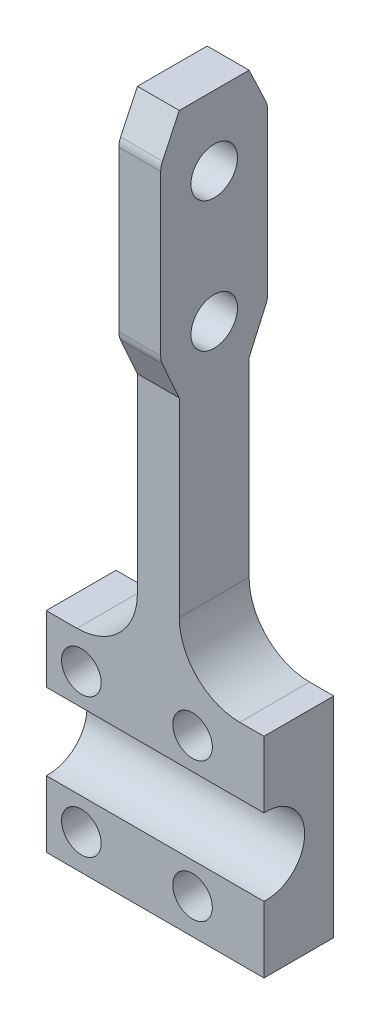
ISO-10303-21;
HEADER;
FILE_DESCRIPTION(('STEP AP214'),'2;1');
FILE_NAME('part.step','',(''),(''),'','','');
FILE_SCHEMA(('AUTOMOTIVE_DESIGN { 1 0 10303 214 1 1 1 1 }'));
ENDSEC;
DATA;
#1=APPLICATION_CONTEXT('core data for automotive mechanical design processes');
#2=APPLICATION_PROTOCOL_DEFINITION('international standard','automotive_design',2000,#1);
#3=PRODUCT_CONTEXT('',#1,'mechanical');
#4=PRODUCT('Part','Part','',(#3));
#5=PRODUCT_RELATED_PRODUCT_CATEGORY('part','',(#4));
#6=PRODUCT_DEFINITION_FORMATION('','',#4);
#7=PRODUCT_DEFINITION_CONTEXT('part definition',#1,'design');
#8=PRODUCT_DEFINITION('design','',#6,#7);
#9=PRODUCT_DEFINITION_SHAPE('','',#8);
#10=(LENGTH_UNIT() NAMED_UNIT(*) SI_UNIT(.MILLI.,.METRE.));
#11=(NAMED_UNIT(*) PLANE_ANGLE_UNIT() SI_UNIT($,.RADIAN.));
#12=(NAMED_UNIT(*) SI_UNIT($,.STERADIAN.) SOLID_ANGLE_UNIT());
#13=UNCERTAINTY_MEASURE_WITH_UNIT(LENGTH_MEASURE(1.E-05),#10,'distance_accuracy_value','');
#14=(GEOMETRIC_REPRESENTATION_CONTEXT(3) GLOBAL_UNCERTAINTY_ASSIGNED_CONTEXT((#13)) GLOBAL_UNIT_ASSIGNED_CONTEXT((#10,
#11,#12)) REPRESENTATION_CONTEXT('',''));
#15=CARTESIAN_POINT('',(0.,0.,0.));
#16=DIRECTION('',(0.,0.,1.));
#17=DIRECTION('',(1.,0.,0.));
#18=AXIS2_PLACEMENT_3D('',#15,#16,#17);
#19=CARTESIAN_POINT('',(27.1,35.5,0.));
#20=DIRECTION('',(0.,0.,1.));
#21=DIRECTION('',(-1.,0.,0.));
#22=AXIS2_PLACEMENT_3D('',#19,#20,#21);
#23=PLANE('',#22);
#24=CARTESIAN_POINT('',(51.95,14.95,0.));
#25=DIRECTION('',(0.,0.,-1.));
#26=DIRECTION('',(-1.,0.,0.));
#27=AXIS2_PLACEMENT_3D('',#24,#25,#26);
#28=CIRCLE('',#27,4.25);
#29=CARTESIAN_POINT('',(47.7,14.95,0.));
#30=VERTEX_POINT('',#29);
#31=EDGE_CURVE('E279',#30,#30,#28,.T.);
#32=ORIENTED_EDGE('',*,*,#31,.F.);
#33=EDGE_LOOP('',(#32));
#34=FACE_BOUND('',#33,.T.);
#35=CARTESIAN_POINT('',(28.05,14.95,0.));
#36=DIRECTION('',(0.,0.,-1.));
#37=DIRECTION('',(-1.,0.,0.));
#38=AXIS2_PLACEMENT_3D('',#35,#36,#37);
#39=CIRCLE('',#38,4.25);
#40=CARTESIAN_POINT('',(23.8,14.95,0.));
#41=VERTEX_POINT('',#40);
#42=EDGE_CURVE('E283',#41,#41,#39,.T.);
#43=ORIENTED_EDGE('',*,*,#42,.F.);
#44=EDGE_LOOP('',(#43));
#45=FACE_BOUND('',#44,.T.);
#46=CARTESIAN_POINT('',(28.05,-14.95,0.));
#47=DIRECTION('',(0.,0.,-1.));
#48=DIRECTION('',(-1.,0.,0.));
#49=AXIS2_PLACEMENT_3D('',#46,#47,#48);
#50=CIRCLE('',#49,4.25);
#51=CARTESIAN_POINT('',(23.8,-14.95,0.));
#52=VERTEX_POINT('',#51);
#53=EDGE_CURVE('E289',#52,#52,#50,.T.);
#54=ORIENTED_EDGE('',*,*,#53,.F.);
#55=EDGE_LOOP('',(#54));
#56=FACE_BOUND('',#55,.T.);
#57=CARTESIAN_POINT('',(51.95,-14.95,0.));
#58=DIRECTION('',(0.,0.,-1.));
#59=DIRECTION('',(-1.,0.,0.));
#60=AXIS2_PLACEMENT_3D('',#57,#58,#59);
#61=CIRCLE('',#60,4.25);
#62=CARTESIAN_POINT('',(47.7,-14.95,0.));
#63=VERTEX_POINT('',#62);
#64=EDGE_CURVE('E295',#63,#63,#61,.T.);
#65=ORIENTED_EDGE('',*,*,#64,.F.);
#66=EDGE_LOOP('',(#65));
#67=FACE_BOUND('',#66,.T.);
#68=DIRECTION('',(1.,0.,0.));
#69=VECTOR('',#68,1.);
#70=CARTESIAN_POINT('',(-13.5624362774462,76.3868514547035,0.));
#71=LINE('',#70,#69);
#72=CARTESIAN_POINT('',(40.1,76.3868514547035,0.));
#73=VERTEX_POINT('',#72);
#74=CARTESIAN_POINT('',(49.1,76.3868514547035,0.));
#75=VERTEX_POINT('',#74);
#76=EDGE_CURVE('E189',#73,#75,#71,.T.);
#77=ORIENTED_EDGE('',*,*,#76,.T.);
#78=DIRECTION('',(0.,-1.,0.));
#79=VECTOR('',#78,1.);
#80=CARTESIAN_POINT('',(49.1,22.5,0.));
#81=LINE('',#80,#79);
#82=CARTESIAN_POINT('',(49.1,35.5,0.));
#83=VERTEX_POINT('',#82);
#84=EDGE_CURVE('E201',#75,#83,#81,.T.);
#85=ORIENTED_EDGE('',*,*,#84,.T.);
#86=CARTESIAN_POINT('',(62.1,35.5,0.));
#87=DIRECTION('',(0.,0.,-1.));
#88=DIRECTION('',(-1.,0.,0.));
#89=AXIS2_PLACEMENT_3D('',#86,#87,#88);
#90=CIRCLE('',#89,13.);
#91=CARTESIAN_POINT('',(62.1,22.5,0.));
#92=VERTEX_POINT('',#91);
#93=EDGE_CURVE('E41',#92,#83,#90,.T.);
#94=ORIENTED_EDGE('',*,*,#93,.F.);
#95=DIRECTION('',(1.,0.,0.));
#96=VECTOR('',#95,1.);
#97=CARTESIAN_POINT('',(49.1,22.5,0.));
#98=LINE('',#97,#96);
#99=CARTESIAN_POINT('',(67.3,22.5,0.));
#100=VERTEX_POINT('',#99);
#101=EDGE_CURVE('E352',#92,#100,#98,.T.);
#102=ORIENTED_EDGE('',*,*,#101,.T.);
#103=DIRECTION('',(0.,-1.,0.));
#104=VECTOR('',#103,1.);
#105=CARTESIAN_POINT('',(67.3,22.5,0.));
#106=LINE('',#105,#104);
#107=CARTESIAN_POINT('',(67.3,-22.5,0.));
#108=VERTEX_POINT('',#107);
#109=EDGE_CURVE('E308',#100,#108,#106,.T.);
#110=ORIENTED_EDGE('',*,*,#109,.T.);
#111=DIRECTION('',(-1.,0.,0.));
#112=VECTOR('',#111,1.);
#113=CARTESIAN_POINT('',(67.3,-22.5,0.));
#114=LINE('',#113,#112);
#115=CARTESIAN_POINT('',(20.5,-22.5,0.));
#116=VERTEX_POINT('',#115);
#117=EDGE_CURVE('E301',#108,#116,#114,.T.);
#118=ORIENTED_EDGE('',*,*,#117,.T.);
#119=DIRECTION('',(0.,1.,0.));
#120=VECTOR('',#119,1.);
#121=CARTESIAN_POINT('',(20.5,-22.5,0.));
#122=LINE('',#121,#120);
#123=CARTESIAN_POINT('',(20.5,22.5,0.));
#124=VERTEX_POINT('',#123);
#125=EDGE_CURVE('E336',#116,#124,#122,.T.);
#126=ORIENTED_EDGE('',*,*,#125,.T.);
#127=DIRECTION('',(1.,0.,0.));
#128=VECTOR('',#127,1.);
#129=CARTESIAN_POINT('',(20.5,22.5,0.));
#130=LINE('',#129,#128);
#131=CARTESIAN_POINT('',(27.0999999999999,22.5,0.));
#132=VERTEX_POINT('',#131);
#133=EDGE_CURVE('E339',#124,#132,#130,.T.);
#134=ORIENTED_EDGE('',*,*,#133,.T.);
#135=CARTESIAN_POINT('',(27.1,35.5,0.));
#136=DIRECTION('',(0.,0.,1.));
#137=DIRECTION('',(-1.,0.,0.));
#138=AXIS2_PLACEMENT_3D('',#135,#136,#137);
#139=CIRCLE('',#138,13.);
#140=CARTESIAN_POINT('',(40.1,35.5000000000001,0.));
#141=VERTEX_POINT('',#140);
#142=EDGE_CURVE('E342',#132,#141,#139,.T.);
#143=ORIENTED_EDGE('',*,*,#142,.T.);
#144=DIRECTION('',(0.,1.,0.));
#145=VECTOR('',#144,1.);
#146=CARTESIAN_POINT('',(40.1,35.5000000000001,0.));
#147=LINE('',#146,#145);
#148=EDGE_CURVE('E345',#141,#73,#147,.T.);
#149=ORIENTED_EDGE('',*,*,#148,.T.);
#150=EDGE_LOOP('',(#77,#85,#94,#102,#110,#118,#126,#134,#143,#149));
#151=FACE_BOUND('',#150,.T.);
#152=ADVANCED_FACE('F33',(#34,#45,#56,#67,#151),#23,.F.);
#153=CARTESIAN_POINT('',(27.1,35.5,15.));
#154=DIRECTION('',(0.,0.,1.));
#155=DIRECTION('',(-1.,0.,0.));
#156=AXIS2_PLACEMENT_3D('',#153,#154,#155);
#157=PLANE('',#156);
#158=DIRECTION('',(1.,0.,0.));
#159=VECTOR('',#158,1.);
#160=CARTESIAN_POINT('',(-13.5624362774462,76.3868514547035,15.));
#161=LINE('',#160,#159);
#162=CARTESIAN_POINT('',(40.1,76.3868514547035,15.));
#163=VERTEX_POINT('',#162);
#164=CARTESIAN_POINT('',(49.1,76.3868514547035,15.));
#165=VERTEX_POINT('',#164);
#166=EDGE_CURVE('E250',#163,#165,#161,.T.);
#167=ORIENTED_EDGE('',*,*,#166,.F.);
#168=DIRECTION('',(0.,1.,0.));
#169=VECTOR('',#168,1.);
#170=CARTESIAN_POINT('',(40.1,35.5000000000001,15.));
#171=LINE('',#170,#169);
#172=CARTESIAN_POINT('',(40.1,35.5000000000001,15.));
#173=VERTEX_POINT('',#172);
#174=EDGE_CURVE('E318',#173,#163,#171,.T.);
#175=ORIENTED_EDGE('',*,*,#174,.F.);
#176=CARTESIAN_POINT('',(27.1,35.5,15.));
#177=DIRECTION('',(0.,0.,1.));
#178=DIRECTION('',(-1.,0.,0.));
#179=AXIS2_PLACEMENT_3D('',#176,#177,#178);
#180=CIRCLE('',#179,13.);
#181=CARTESIAN_POINT('',(27.0999999999999,22.5,15.));
#182=VERTEX_POINT('',#181);
#183=EDGE_CURVE('E315',#182,#173,#180,.T.);
#184=ORIENTED_EDGE('',*,*,#183,.F.);
#185=DIRECTION('',(1.,0.,0.));
#186=VECTOR('',#185,1.);
#187=CARTESIAN_POINT('',(20.5,22.5,15.));
#188=LINE('',#187,#186);
#189=CARTESIAN_POINT('',(20.5,22.5,15.));
#190=VERTEX_POINT('',#189);
#191=EDGE_CURVE('E312',#190,#182,#188,.T.);
#192=ORIENTED_EDGE('',*,*,#191,.F.);
#193=DIRECTION('',(0.,1.,0.));
#194=VECTOR('',#193,1.);
#195=CARTESIAN_POINT('',(20.5,-22.5,15.));
#196=LINE('',#195,#194);
#197=CARTESIAN_POINT('',(20.5,8.2348345460003,15.));
#198=VERTEX_POINT('',#197);
#199=EDGE_CURVE('E307',#198,#190,#196,.T.);
#200=ORIENTED_EDGE('',*,*,#199,.F.);
#201=DIRECTION('',(1.,0.,0.));
#202=VECTOR('',#201,1.);
#203=CARTESIAN_POINT('',(12.25,8.2348345460003,15.));
#204=LINE('',#203,#202);
#205=CARTESIAN_POINT('',(67.3,8.23483454600031,15.));
#206=VERTEX_POINT('',#205);
#207=EDGE_CURVE('E276',#198,#206,#204,.T.);
#208=ORIENTED_EDGE('',*,*,#207,.T.);
#209=DIRECTION('',(0.,-1.,0.));
#210=VECTOR('',#209,1.);
#211=CARTESIAN_POINT('',(67.3,22.5,15.));
#212=LINE('',#211,#210);
#213=CARTESIAN_POINT('',(67.3,22.5,15.));
#214=VERTEX_POINT('',#213);
#215=EDGE_CURVE('E330',#214,#206,#212,.T.);
#216=ORIENTED_EDGE('',*,*,#215,.F.);
#217=DIRECTION('',(1.,0.,0.));
#218=VECTOR('',#217,1.);
#219=CARTESIAN_POINT('',(49.1,22.5,15.));
#220=LINE('',#219,#218);
#221=CARTESIAN_POINT('',(62.1,22.5,15.));
#222=VERTEX_POINT('',#221);
#223=EDGE_CURVE('E326',#222,#214,#220,.T.);
#224=ORIENTED_EDGE('',*,*,#223,.F.);
#225=CARTESIAN_POINT('',(62.1,35.5,15.));
#226=DIRECTION('',(0.,0.,-1.));
#227=DIRECTION('',(-1.,0.,0.));
#228=AXIS2_PLACEMENT_3D('',#225,#226,#227);
#229=CIRCLE('',#228,13.);
#230=CARTESIAN_POINT('',(49.1,35.5,15.));
#231=VERTEX_POINT('',#230);
#232=EDGE_CURVE('E11',#231,#222,#229,.F.);
#233=ORIENTED_EDGE('',*,*,#232,.F.);
#234=DIRECTION('',(0.,-1.,0.));
#235=VECTOR('',#234,1.);
#236=CARTESIAN_POINT('',(49.1,22.5,15.));
#237=LINE('',#236,#235);
#238=EDGE_CURVE('E324',#165,#231,#237,.T.);
#239=ORIENTED_EDGE('',*,*,#238,.F.);
#240=EDGE_LOOP('',(#167,#175,#184,#192,#200,#208,#216,#224,#233,#239));
#241=FACE_BOUND('',#240,.T.);
#242=CARTESIAN_POINT('',(51.95,14.95,15.));
#243=DIRECTION('',(0.,0.,-1.));
#244=DIRECTION('',(-1.,0.,0.));
#245=AXIS2_PLACEMENT_3D('',#242,#243,#244);
#246=CIRCLE('',#245,4.25);
#247=CARTESIAN_POINT('',(47.7,14.95,15.));
#248=VERTEX_POINT('',#247);
#249=EDGE_CURVE('E280',#248,#248,#246,.T.);
#250=ORIENTED_EDGE('',*,*,#249,.T.);
#251=EDGE_LOOP('',(#250));
#252=FACE_BOUND('',#251,.T.);
#253=CARTESIAN_POINT('',(28.05,14.95,15.));
#254=DIRECTION('',(0.,0.,-1.));
#255=DIRECTION('',(-1.,0.,0.));
#256=AXIS2_PLACEMENT_3D('',#253,#254,#255);
#257=CIRCLE('',#256,4.25);
#258=CARTESIAN_POINT('',(23.8,14.95,15.));
#259=VERTEX_POINT('',#258);
#260=EDGE_CURVE('E286',#259,#259,#257,.T.);
#261=ORIENTED_EDGE('',*,*,#260,.T.);
#262=EDGE_LOOP('',(#261));
#263=FACE_BOUND('',#262,.T.);
#264=ADVANCED_FACE('F423',(#241,#252,#263),#157,.T.);
#265=DIRECTION('',(1.,0.,0.));
#266=VECTOR('',#265,1.);
#267=CARTESIAN_POINT('',(12.25,-8.2348345460003,15.));
#268=LINE('',#267,#266);
#269=CARTESIAN_POINT('',(67.3,-8.23483454600029,15.));
#270=VERTEX_POINT('',#269);
#271=CARTESIAN_POINT('',(20.5,-8.2348345460003,15.));
#272=VERTEX_POINT('',#271);
#273=EDGE_CURVE('E273',#270,#272,#268,.F.);
#274=ORIENTED_EDGE('',*,*,#273,.T.);
#275=CARTESIAN_POINT('',(20.5,-22.5,15.));
#276=VERTEX_POINT('',#275);
#277=EDGE_CURVE('E309',#276,#272,#196,.T.);
#278=ORIENTED_EDGE('',*,*,#277,.F.);
#279=DIRECTION('',(-1.,0.,0.));
#280=VECTOR('',#279,1.);
#281=CARTESIAN_POINT('',(67.3,-22.5,15.));
#282=LINE('',#281,#280);
#283=CARTESIAN_POINT('',(67.3,-22.5,15.));
#284=VERTEX_POINT('',#283);
#285=EDGE_CURVE('E304',#284,#276,#282,.T.);
#286=ORIENTED_EDGE('',*,*,#285,.F.);
#287=EDGE_CURVE('E329',#270,#284,#212,.T.);
#288=ORIENTED_EDGE('',*,*,#287,.F.);
#289=EDGE_LOOP('',(#274,#278,#286,#288));
#290=FACE_BOUND('',#289,.T.);
#291=CARTESIAN_POINT('',(51.95,-14.95,15.));
#292=DIRECTION('',(0.,0.,-1.));
#293=DIRECTION('',(-1.,0.,0.));
#294=AXIS2_PLACEMENT_3D('',#291,#292,#293);
#295=CIRCLE('',#294,4.25);
#296=CARTESIAN_POINT('',(47.7,-14.95,15.));
#297=VERTEX_POINT('',#296);
#298=EDGE_CURVE('E298',#297,#297,#295,.T.);
#299=ORIENTED_EDGE('',*,*,#298,.T.);
#300=EDGE_LOOP('',(#299));
#301=FACE_BOUND('',#300,.T.);
#302=CARTESIAN_POINT('',(28.05,-14.95,15.));
#303=DIRECTION('',(0.,0.,-1.));
#304=DIRECTION('',(-1.,0.,0.));
#305=AXIS2_PLACEMENT_3D('',#302,#303,#304);
#306=CIRCLE('',#305,4.25);
#307=CARTESIAN_POINT('',(23.8,-14.95,15.));
#308=VERTEX_POINT('',#307);
#309=EDGE_CURVE('E292',#308,#308,#306,.T.);
#310=ORIENTED_EDGE('',*,*,#309,.T.);
#311=EDGE_LOOP('',(#310));
#312=FACE_BOUND('',#311,.T.);
#313=ADVANCED_FACE('F429',(#290,#301,#312),#157,.T.);
#314=CARTESIAN_POINT('',(67.3,-22.5,15.));
#315=DIRECTION('',(0.,1.,0.));
#316=DIRECTION('',(0.,0.,1.));
#317=AXIS2_PLACEMENT_3D('',#314,#315,#316);
#318=PLANE('',#317);
#319=ORIENTED_EDGE('',*,*,#117,.F.);
#320=DIRECTION('',(0.,0.,-1.));
#321=VECTOR('',#320,1.);
#322=CARTESIAN_POINT('',(67.3,-22.5,15.));
#323=LINE('',#322,#321);
#324=EDGE_CURVE('E333',#284,#108,#323,.T.);
#325=ORIENTED_EDGE('',*,*,#324,.F.);
#326=ORIENTED_EDGE('',*,*,#285,.T.);
#327=DIRECTION('',(0.,0.,-1.));
#328=VECTOR('',#327,1.);
#329=CARTESIAN_POINT('',(20.5,-22.5,15.));
#330=LINE('',#329,#328);
#331=EDGE_CURVE('E372',#276,#116,#330,.T.);
#332=ORIENTED_EDGE('',*,*,#331,.T.);
#333=EDGE_LOOP('',(#319,#325,#326,#332));
#334=FACE_BOUND('',#333,.T.);
#335=ADVANCED_FACE('F463',(#334),#318,.F.);
#336=CARTESIAN_POINT('',(20.5,-22.5,15.));
#337=DIRECTION('',(1.,0.,0.));
#338=DIRECTION('',(0.,-1.,0.));
#339=AXIS2_PLACEMENT_3D('',#336,#337,#338);
#340=PLANE('',#339);
#341=ORIENTED_EDGE('',*,*,#199,.T.);
#342=DIRECTION('',(0.,0.,-1.));
#343=VECTOR('',#342,1.);
#344=CARTESIAN_POINT('',(20.5,22.5,15.));
#345=LINE('',#344,#343);
#346=EDGE_CURVE('E370',#190,#124,#345,.T.);
#347=ORIENTED_EDGE('',*,*,#346,.T.);
#348=ORIENTED_EDGE('',*,*,#125,.F.);
#349=ORIENTED_EDGE('',*,*,#331,.F.);
#350=ORIENTED_EDGE('',*,*,#277,.T.);
#351=CARTESIAN_POINT('',(20.5,0.,14.5));
#352=DIRECTION('',(-1.,0.,0.));
#353=DIRECTION('',(0.,-1.,0.));
#354=AXIS2_PLACEMENT_3D('',#351,#352,#353);
#355=CIRCLE('',#354,8.25);
#356=EDGE_CURVE('E270',#198,#272,#355,.T.);
#357=ORIENTED_EDGE('',*,*,#356,.F.);
#358=EDGE_LOOP('',(#341,#347,#348,#349,#350,#357));
#359=FACE_BOUND('',#358,.T.);
#360=ADVANCED_FACE('F460',(#359),#340,.F.);
#361=CARTESIAN_POINT('',(20.5,22.5,15.));
#362=DIRECTION('',(0.,-1.,0.));
#363=DIRECTION('',(0.,0.,-1.));
#364=AXIS2_PLACEMENT_3D('',#361,#362,#363);
#365=PLANE('',#364);
#366=ORIENTED_EDGE('',*,*,#133,.F.);
#367=ORIENTED_EDGE('',*,*,#346,.F.);
#368=ORIENTED_EDGE('',*,*,#191,.T.);
#369=DIRECTION('',(0.,0.,-1.));
#370=VECTOR('',#369,1.);
#371=CARTESIAN_POINT('',(27.0999999999999,22.5,15.));
#372=LINE('',#371,#370);
#373=EDGE_CURVE('E368',#182,#132,#372,.T.);
#374=ORIENTED_EDGE('',*,*,#373,.T.);
#375=EDGE_LOOP('',(#366,#367,#368,#374));
#376=FACE_BOUND('',#375,.T.);
#377=ADVANCED_FACE('F456',(#376),#365,.F.);
#378=CARTESIAN_POINT('',(27.1,35.5,15.));
#379=DIRECTION('',(0.,0.,-1.));
#380=DIRECTION('',(1.,0.,0.));
#381=AXIS2_PLACEMENT_3D('',#378,#379,#380);
#382=CYLINDRICAL_SURFACE('',#381,13.);
#383=ORIENTED_EDGE('',*,*,#142,.F.);
#384=ORIENTED_EDGE('',*,*,#373,.F.);
#385=ORIENTED_EDGE('',*,*,#183,.T.);
#386=DIRECTION('',(0.,0.,-1.));
#387=VECTOR('',#386,1.);
#388=CARTESIAN_POINT('',(40.1,35.5000000000001,15.));
#389=LINE('',#388,#387);
#390=EDGE_CURVE('E366',#173,#141,#389,.T.);
#391=ORIENTED_EDGE('',*,*,#390,.T.);
#392=EDGE_LOOP('',(#383,#384,#385,#391));
#393=FACE_BOUND('',#392,.T.);
#394=ADVANCED_FACE('F452',(#393),#382,.F.);
#395=CARTESIAN_POINT('',(40.1,35.5000000000001,15.));
#396=DIRECTION('',(1.,0.,0.));
#397=DIRECTION('',(0.,0.,1.));
#398=AXIS2_PLACEMENT_3D('',#395,#396,#397);
#399=PLANE('',#398);
#400=CARTESIAN_POINT('',(40.1,86.9,7.5));
#401=DIRECTION('',(1.,0.,0.));
#402=DIRECTION('',(0.,0.,-1.));
#403=AXIS2_PLACEMENT_3D('',#400,#401,#402);
#404=CIRCLE('',#403,5.);
#405=CARTESIAN_POINT('',(40.1,86.9,2.5));
#406=VERTEX_POINT('',#405);
#407=EDGE_CURVE('E262',#406,#406,#404,.T.);
#408=ORIENTED_EDGE('',*,*,#407,.T.);
#409=EDGE_LOOP('',(#408));
#410=FACE_BOUND('',#409,.T.);
#411=CARTESIAN_POINT('',(40.1,114.9,7.5));
#412=DIRECTION('',(1.,0.,0.));
#413=DIRECTION('',(0.,0.,-1.));
#414=AXIS2_PLACEMENT_3D('',#411,#412,#413);
#415=CIRCLE('',#414,5.);
#416=CARTESIAN_POINT('',(40.1,114.9,2.5));
#417=VERTEX_POINT('',#416);
#418=EDGE_CURVE('E261',#417,#417,#415,.T.);
#419=ORIENTED_EDGE('',*,*,#418,.T.);
#420=EDGE_LOOP('',(#419));
#421=FACE_BOUND('',#420,.T.);
#422=ORIENTED_EDGE('',*,*,#148,.F.);
#423=ORIENTED_EDGE('',*,*,#390,.F.);
#424=ORIENTED_EDGE('',*,*,#174,.T.);
#425=DIRECTION('',(0.,-0.912907574661992,-0.408166338794321));
#426=VECTOR('',#425,1.);
#427=CARTESIAN_POINT('',(40.1,76.3868514547035,15.));
#428=LINE('',#427,#426);
#429=CARTESIAN_POINT('',(40.1,84.5541123056302,18.651630298648));
#430=VERTEX_POINT('',#429);
#431=EDGE_CURVE('E236',#430,#163,#428,.T.);
#432=ORIENTED_EDGE('',*,*,#431,.F.);
#433=CARTESIAN_POINT('',(40.1,86.1867776608075,15.));
#434=DIRECTION('',(-1.,0.,0.));
#435=DIRECTION('',(0.,0.,1.));
#436=AXIS2_PLACEMENT_3D('',#433,#434,#435);
#437=CIRCLE('',#436,4.);
#438=CARTESIAN_POINT('',(40.1,86.1867776608075,19.));
#439=VERTEX_POINT('',#438);
#440=EDGE_CURVE('E223',#439,#430,#437,.F.);
#441=ORIENTED_EDGE('',*,*,#440,.F.);
#442=DIRECTION('',(0.,-1.,0.));
#443=VECTOR('',#442,1.);
#444=CARTESIAN_POINT('',(40.1,86.1867776608075,19.));
#445=LINE('',#444,#443);
#446=CARTESIAN_POINT('',(40.1,120.550049195899,19.));
#447=VERTEX_POINT('',#446);
#448=EDGE_CURVE('E226',#447,#439,#445,.T.);
#449=ORIENTED_EDGE('',*,*,#448,.F.);
#450=CARTESIAN_POINT('',(40.1,120.550049195899,15.));
#451=DIRECTION('',(-1.,0.,0.));
#452=DIRECTION('',(0.,0.,1.));
#453=AXIS2_PLACEMENT_3D('',#450,#451,#452);
#454=CIRCLE('',#453,4.);
#455=CARTESIAN_POINT('',(40.1,122.261288146267,18.6154752460423));
#456=VERTEX_POINT('',#455);
#457=EDGE_CURVE('E230',#456,#447,#454,.F.);
#458=ORIENTED_EDGE('',*,*,#457,.F.);
#459=DIRECTION('',(0.,-0.903868811510564,0.427809737591936));
#460=VECTOR('',#459,1.);
#461=CARTESIAN_POINT('',(40.1,122.261288146267,18.6154752460423));
#462=LINE('',#461,#460);
#463=CARTESIAN_POINT('',(40.1,129.9,15.));
#464=VERTEX_POINT('',#463);
#465=EDGE_CURVE('E233',#464,#456,#462,.T.);
#466=ORIENTED_EDGE('',*,*,#465,.F.);
#467=DIRECTION('',(0.,0.,-1.));
#468=VECTOR('',#467,1.);
#469=CARTESIAN_POINT('',(40.1,129.9,15.));
#470=LINE('',#469,#468);
#471=CARTESIAN_POINT('',(40.1,129.9,0.));
#472=VERTEX_POINT('',#471);
#473=EDGE_CURVE('E363',#464,#472,#470,.T.);
#474=ORIENTED_EDGE('',*,*,#473,.T.);
#475=DIRECTION('',(0.,0.903868811510564,0.427809737591936));
#476=VECTOR('',#475,1.);
#477=CARTESIAN_POINT('',(40.1,122.261288146267,-3.61547524604226));
#478=LINE('',#477,#476);
#479=CARTESIAN_POINT('',(40.1,122.261288146267,-3.61547524604226));
#480=VERTEX_POINT('',#479);
#481=EDGE_CURVE('E214',#480,#472,#478,.T.);
#482=ORIENTED_EDGE('',*,*,#481,.F.);
#483=CARTESIAN_POINT('',(40.1,120.550049195899,0.));
#484=DIRECTION('',(-1.,0.,0.));
#485=DIRECTION('',(0.,0.,1.));
#486=AXIS2_PLACEMENT_3D('',#483,#484,#485);
#487=CIRCLE('',#486,4.);
#488=CARTESIAN_POINT('',(40.1,120.550049195899,-4.));
#489=VERTEX_POINT('',#488);
#490=EDGE_CURVE('E391',#489,#480,#487,.F.);
#491=ORIENTED_EDGE('',*,*,#490,.F.);
#492=DIRECTION('',(0.,1.,0.));
#493=VECTOR('',#492,1.);
#494=CARTESIAN_POINT('',(40.1,86.1867776608075,-3.99999999999999));
#495=LINE('',#494,#493);
#496=CARTESIAN_POINT('',(40.1,86.1867776608075,-3.99999999999999));
#497=VERTEX_POINT('',#496);
#498=EDGE_CURVE('E390',#497,#489,#495,.T.);
#499=ORIENTED_EDGE('',*,*,#498,.F.);
#500=CARTESIAN_POINT('',(40.1,86.1867776608075,0.));
#501=DIRECTION('',(-1.,0.,0.));
#502=DIRECTION('',(0.,0.,1.));
#503=AXIS2_PLACEMENT_3D('',#500,#501,#502);
#504=CIRCLE('',#503,4.);
#505=CARTESIAN_POINT('',(40.1,84.5541123056302,-3.65163029864797));
#506=VERTEX_POINT('',#505);
#507=EDGE_CURVE('E222',#506,#497,#504,.F.);
#508=ORIENTED_EDGE('',*,*,#507,.F.);
#509=DIRECTION('',(0.,0.912907574661992,-0.40816633879432));
#510=VECTOR('',#509,1.);
#511=CARTESIAN_POINT('',(40.1,76.3868514547035,0.));
#512=LINE('',#511,#510);
#513=EDGE_CURVE('E185',#73,#506,#512,.T.);
#514=ORIENTED_EDGE('',*,*,#513,.F.);
#515=EDGE_LOOP('',(#422,#423,#424,#432,#441,#449,#458,#466,#474,#482,#491,#499,#508,#514));
#516=FACE_BOUND('',#515,.T.);
#517=ADVANCED_FACE('F386',(#410,#421,#516),#399,.F.);
#518=CARTESIAN_POINT('',(49.1,129.9,15.));
#519=DIRECTION('',(0.,-1.,0.));
#520=DIRECTION('',(0.,0.,-1.));
#521=AXIS2_PLACEMENT_3D('',#518,#519,#520);
#522=PLANE('',#521);
#523=DIRECTION('',(1.,0.,0.));
#524=VECTOR('',#523,1.);
#525=CARTESIAN_POINT('',(49.1,129.9,0.));
#526=LINE('',#525,#524);
#527=CARTESIAN_POINT('',(49.1,129.9,0.));
#528=VERTEX_POINT('',#527);
#529=EDGE_CURVE('E348',#472,#528,#526,.T.);
#530=ORIENTED_EDGE('',*,*,#529,.F.);
#531=ORIENTED_EDGE('',*,*,#473,.F.);
#532=DIRECTION('',(1.,0.,0.));
#533=VECTOR('',#532,1.);
#534=CARTESIAN_POINT('',(49.1,129.9,15.));
#535=LINE('',#534,#533);
#536=CARTESIAN_POINT('',(49.1,129.9,15.));
#537=VERTEX_POINT('',#536);
#538=EDGE_CURVE('E321',#464,#537,#535,.T.);
#539=ORIENTED_EDGE('',*,*,#538,.T.);
#540=DIRECTION('',(0.,0.,-1.));
#541=VECTOR('',#540,1.);
#542=CARTESIAN_POINT('',(49.1,129.9,15.));
#543=LINE('',#542,#541);
#544=EDGE_CURVE('E360',#537,#528,#543,.T.);
#545=ORIENTED_EDGE('',*,*,#544,.T.);
#546=EDGE_LOOP('',(#530,#531,#539,#545));
#547=FACE_BOUND('',#546,.T.);
#548=ADVANCED_FACE('F404',(#547),#522,.F.);
#549=CARTESIAN_POINT('',(49.1,22.5,15.));
#550=DIRECTION('',(-1.,0.,0.));
#551=DIRECTION('',(0.,0.,-1.));
#552=AXIS2_PLACEMENT_3D('',#549,#550,#551);
#553=PLANE('',#552);
#554=CARTESIAN_POINT('',(49.1,86.9,7.5));
#555=DIRECTION('',(1.,0.,0.));
#556=DIRECTION('',(0.,0.,-1.));
#557=AXIS2_PLACEMENT_3D('',#554,#555,#556);
#558=CIRCLE('',#557,5.);
#559=CARTESIAN_POINT('',(49.1,86.9,2.5));
#560=VERTEX_POINT('',#559);
#561=EDGE_CURVE('E271',#560,#560,#558,.T.);
#562=ORIENTED_EDGE('',*,*,#561,.F.);
#563=EDGE_LOOP('',(#562));
#564=FACE_BOUND('',#563,.T.);
#565=CARTESIAN_POINT('',(49.1,114.9,7.5));
#566=DIRECTION('',(1.,0.,0.));
#567=DIRECTION('',(0.,0.,-1.));
#568=AXIS2_PLACEMENT_3D('',#565,#566,#567);
#569=CIRCLE('',#568,5.);
#570=CARTESIAN_POINT('',(49.1,114.9,2.5));
#571=VERTEX_POINT('',#570);
#572=EDGE_CURVE('E265',#571,#571,#569,.T.);
#573=ORIENTED_EDGE('',*,*,#572,.F.);
#574=EDGE_LOOP('',(#573));
#575=FACE_BOUND('',#574,.T.);
#576=ORIENTED_EDGE('',*,*,#84,.F.);
#577=DIRECTION('',(0.,-0.912907574661992,0.40816633879432));
#578=VECTOR('',#577,1.);
#579=CARTESIAN_POINT('',(49.1,76.3868514547035,0.));
#580=LINE('',#579,#578);
#581=CARTESIAN_POINT('',(49.1,84.5541123056302,-3.65163029864797));
#582=VERTEX_POINT('',#581);
#583=EDGE_CURVE('E184',#582,#75,#580,.T.);
#584=ORIENTED_EDGE('',*,*,#583,.F.);
#585=CARTESIAN_POINT('',(49.1,86.1867776608075,0.));
#586=DIRECTION('',(-1.,0.,0.));
#587=DIRECTION('',(0.,0.,-1.));
#588=AXIS2_PLACEMENT_3D('',#585,#586,#587);
#589=CIRCLE('',#588,4.);
#590=CARTESIAN_POINT('',(49.1,86.1867776608075,-3.99999999999999));
#591=VERTEX_POINT('',#590);
#592=EDGE_CURVE('E193',#591,#582,#589,.T.);
#593=ORIENTED_EDGE('',*,*,#592,.F.);
#594=DIRECTION('',(0.,-1.,0.));
#595=VECTOR('',#594,1.);
#596=CARTESIAN_POINT('',(49.1,86.1867776608075,-3.99999999999999));
#597=LINE('',#596,#595);
#598=CARTESIAN_POINT('',(49.1,120.550049195899,-4.));
#599=VERTEX_POINT('',#598);
#600=EDGE_CURVE('E190',#599,#591,#597,.T.);
#601=ORIENTED_EDGE('',*,*,#600,.F.);
#602=CARTESIAN_POINT('',(49.1,120.550049195899,0.));
#603=DIRECTION('',(-1.,0.,0.));
#604=DIRECTION('',(0.,0.,-1.));
#605=AXIS2_PLACEMENT_3D('',#602,#603,#604);
#606=CIRCLE('',#605,4.);
#607=CARTESIAN_POINT('',(49.1,122.261288146267,-3.61547524604226));
#608=VERTEX_POINT('',#607);
#609=EDGE_CURVE('E206',#608,#599,#606,.T.);
#610=ORIENTED_EDGE('',*,*,#609,.F.);
#611=DIRECTION('',(0.,-0.903868811510564,-0.427809737591936));
#612=VECTOR('',#611,1.);
#613=CARTESIAN_POINT('',(49.1,122.261288146267,-3.61547524604226));
#614=LINE('',#613,#612);
#615=EDGE_CURVE('E203',#528,#608,#614,.T.);
#616=ORIENTED_EDGE('',*,*,#615,.F.);
#617=ORIENTED_EDGE('',*,*,#544,.F.);
#618=DIRECTION('',(0.,0.903868811510564,-0.427809737591936));
#619=VECTOR('',#618,1.);
#620=CARTESIAN_POINT('',(49.1,122.261288146267,18.6154752460423));
#621=LINE('',#620,#619);
#622=CARTESIAN_POINT('',(49.1,122.261288146267,18.6154752460423));
#623=VERTEX_POINT('',#622);
#624=EDGE_CURVE('E248',#623,#537,#621,.T.);
#625=ORIENTED_EDGE('',*,*,#624,.F.);
#626=CARTESIAN_POINT('',(49.1,120.550049195899,15.));
#627=DIRECTION('',(-1.,0.,0.));
#628=DIRECTION('',(0.,0.,1.));
#629=AXIS2_PLACEMENT_3D('',#626,#627,#628);
#630=CIRCLE('',#629,4.);
#631=CARTESIAN_POINT('',(49.1,120.550049195899,19.));
#632=VERTEX_POINT('',#631);
#633=EDGE_CURVE('E245',#632,#623,#630,.T.);
#634=ORIENTED_EDGE('',*,*,#633,.F.);
#635=DIRECTION('',(0.,1.,0.));
#636=VECTOR('',#635,1.);
#637=CARTESIAN_POINT('',(49.1,86.1867776608075,19.));
#638=LINE('',#637,#636);
#639=CARTESIAN_POINT('',(49.1,86.1867776608075,19.));
#640=VERTEX_POINT('',#639);
#641=EDGE_CURVE('E242',#640,#632,#638,.T.);
#642=ORIENTED_EDGE('',*,*,#641,.F.);
#643=CARTESIAN_POINT('',(49.1,86.1867776608075,15.));
#644=DIRECTION('',(-1.,0.,0.));
#645=DIRECTION('',(0.,0.,1.));
#646=AXIS2_PLACEMENT_3D('',#643,#644,#645);
#647=CIRCLE('',#646,4.);
#648=CARTESIAN_POINT('',(49.1,84.5541123056302,18.651630298648));
#649=VERTEX_POINT('',#648);
#650=EDGE_CURVE('E239',#649,#640,#647,.T.);
#651=ORIENTED_EDGE('',*,*,#650,.F.);
#652=DIRECTION('',(0.,0.912907574661992,0.408166338794321));
#653=VECTOR('',#652,1.);
#654=CARTESIAN_POINT('',(49.1,76.3868514547035,15.));
#655=LINE('',#654,#653);
#656=EDGE_CURVE('E221',#165,#649,#655,.T.);
#657=ORIENTED_EDGE('',*,*,#656,.F.);
#658=ORIENTED_EDGE('',*,*,#238,.T.);
#659=DIRECTION('',(0.,0.,-1.));
#660=VECTOR('',#659,1.);
#661=CARTESIAN_POINT('',(49.1,35.5,15.));
#662=LINE('',#661,#660);
#663=EDGE_CURVE('E47',#83,#231,#662,.F.);
#664=ORIENTED_EDGE('',*,*,#663,.F.);
#665=EDGE_LOOP('',(#576,#584,#593,#601,#610,#616,#617,#625,#634,#642,#651,#657,#658,#664));
#666=FACE_BOUND('',#665,.T.);
#667=ADVANCED_FACE('F199',(#564,#575,#666),#553,.F.);
#668=CARTESIAN_POINT('',(49.1,22.5,15.));
#669=DIRECTION('',(0.,-1.,0.));
#670=DIRECTION('',(0.,0.,-1.));
#671=AXIS2_PLACEMENT_3D('',#668,#669,#670);
#672=PLANE('',#671);
#673=ORIENTED_EDGE('',*,*,#223,.T.);
#674=DIRECTION('',(0.,0.,-1.));
#675=VECTOR('',#674,1.);
#676=CARTESIAN_POINT('',(67.3,22.5,15.));
#677=LINE('',#676,#675);
#678=EDGE_CURVE('E358',#214,#100,#677,.T.);
#679=ORIENTED_EDGE('',*,*,#678,.T.);
#680=ORIENTED_EDGE('',*,*,#101,.F.);
#681=DIRECTION('',(0.,0.,-1.));
#682=VECTOR('',#681,1.);
#683=CARTESIAN_POINT('',(62.1,22.5,0.));
#684=LINE('',#683,#682);
#685=EDGE_CURVE('E374',#222,#92,#684,.T.);
#686=ORIENTED_EDGE('',*,*,#685,.F.);
#687=EDGE_LOOP('',(#673,#679,#680,#686));
#688=FACE_BOUND('',#687,.T.);
#689=ADVANCED_FACE('F440',(#688),#672,.F.);
#690=CARTESIAN_POINT('',(67.3,22.5,15.));
#691=DIRECTION('',(-1.,0.,0.));
#692=DIRECTION('',(0.,0.,-1.));
#693=AXIS2_PLACEMENT_3D('',#690,#691,#692);
#694=PLANE('',#693);
#695=ORIENTED_EDGE('',*,*,#287,.T.);
#696=ORIENTED_EDGE('',*,*,#324,.T.);
#697=ORIENTED_EDGE('',*,*,#109,.F.);
#698=ORIENTED_EDGE('',*,*,#678,.F.);
#699=ORIENTED_EDGE('',*,*,#215,.T.);
#700=CARTESIAN_POINT('',(67.3,0.,14.5));
#701=DIRECTION('',(-1.,0.,0.));
#702=DIRECTION('',(0.,0.,1.));
#703=AXIS2_PLACEMENT_3D('',#700,#701,#702);
#704=CIRCLE('',#703,8.25);
#705=EDGE_CURVE('E268',#206,#270,#704,.T.);
#706=ORIENTED_EDGE('',*,*,#705,.T.);
#707=EDGE_LOOP('',(#695,#696,#697,#698,#699,#706));
#708=FACE_BOUND('',#707,.T.);
#709=ADVANCED_FACE('F436',(#708),#694,.F.);
#710=CARTESIAN_POINT('',(51.95,-14.95,15.));
#711=DIRECTION('',(0.,0.,-1.));
#712=DIRECTION('',(1.,0.,0.));
#713=AXIS2_PLACEMENT_3D('',#710,#711,#712);
#714=CYLINDRICAL_SURFACE('',#713,4.25);
#715=ORIENTED_EDGE('',*,*,#298,.F.);
#716=EDGE_LOOP('',(#715));
#717=FACE_BOUND('',#716,.T.);
#718=ORIENTED_EDGE('',*,*,#64,.T.);
#719=EDGE_LOOP('',(#718));
#720=FACE_BOUND('',#719,.T.);
#721=ADVANCED_FACE('F439',(#717,#720),#714,.F.);
#722=CARTESIAN_POINT('',(28.05,-14.95,15.));
#723=DIRECTION('',(0.,0.,-1.));
#724=DIRECTION('',(1.,0.,0.));
#725=AXIS2_PLACEMENT_3D('',#722,#723,#724);
#726=CYLINDRICAL_SURFACE('',#725,4.25);
#727=ORIENTED_EDGE('',*,*,#309,.F.);
#728=EDGE_LOOP('',(#727));
#729=FACE_BOUND('',#728,.T.);
#730=ORIENTED_EDGE('',*,*,#53,.T.);
#731=EDGE_LOOP('',(#730));
#732=FACE_BOUND('',#731,.T.);
#733=ADVANCED_FACE('F536',(#729,#732),#726,.F.);
#734=CARTESIAN_POINT('',(28.05,14.95,15.));
#735=DIRECTION('',(0.,0.,-1.));
#736=DIRECTION('',(1.,0.,0.));
#737=AXIS2_PLACEMENT_3D('',#734,#735,#736);
#738=CYLINDRICAL_SURFACE('',#737,4.25);
#739=ORIENTED_EDGE('',*,*,#260,.F.);
#740=EDGE_LOOP('',(#739));
#741=FACE_BOUND('',#740,.T.);
#742=ORIENTED_EDGE('',*,*,#42,.T.);
#743=EDGE_LOOP('',(#742));
#744=FACE_BOUND('',#743,.T.);
#745=ADVANCED_FACE('F532',(#741,#744),#738,.F.);
#746=CARTESIAN_POINT('',(51.95,14.95,15.));
#747=DIRECTION('',(0.,0.,-1.));
#748=DIRECTION('',(1.,0.,0.));
#749=AXIS2_PLACEMENT_3D('',#746,#747,#748);
#750=CYLINDRICAL_SURFACE('',#749,4.25);
#751=ORIENTED_EDGE('',*,*,#249,.F.);
#752=EDGE_LOOP('',(#751));
#753=FACE_BOUND('',#752,.T.);
#754=ORIENTED_EDGE('',*,*,#31,.T.);
#755=EDGE_LOOP('',(#754));
#756=FACE_BOUND('',#755,.T.);
#757=ADVANCED_FACE('F528',(#753,#756),#750,.F.);
#758=CARTESIAN_POINT('',(12.25,0.,14.5));
#759=DIRECTION('',(1.,0.,0.));
#760=DIRECTION('',(0.,0.,1.));
#761=AXIS2_PLACEMENT_3D('',#758,#759,#760);
#762=CYLINDRICAL_SURFACE('',#761,8.25);
#763=ORIENTED_EDGE('',*,*,#207,.F.);
#764=ORIENTED_EDGE('',*,*,#356,.T.);
#765=ORIENTED_EDGE('',*,*,#273,.F.);
#766=ORIENTED_EDGE('',*,*,#705,.F.);
#767=EDGE_LOOP('',(#763,#764,#765,#766));
#768=FACE_BOUND('',#767,.T.);
#769=ADVANCED_FACE('F524',(#768),#762,.F.);
#770=CARTESIAN_POINT('',(86.15,114.9,7.5));
#771=DIRECTION('',(-1.,0.,0.));
#772=DIRECTION('',(0.,0.,-1.));
#773=AXIS2_PLACEMENT_3D('',#770,#771,#772);
#774=CYLINDRICAL_SURFACE('',#773,5.);
#775=ORIENTED_EDGE('',*,*,#418,.F.);
#776=EDGE_LOOP('',(#775));
#777=FACE_BOUND('',#776,.T.);
#778=ORIENTED_EDGE('',*,*,#572,.T.);
#779=EDGE_LOOP('',(#778));
#780=FACE_BOUND('',#779,.T.);
#781=ADVANCED_FACE('F511',(#777,#780),#774,.F.);
#782=CARTESIAN_POINT('',(86.15,86.9,7.5));
#783=DIRECTION('',(-1.,0.,0.));
#784=DIRECTION('',(0.,0.,-1.));
#785=AXIS2_PLACEMENT_3D('',#782,#783,#784);
#786=CYLINDRICAL_SURFACE('',#785,5.);
#787=ORIENTED_EDGE('',*,*,#407,.F.);
#788=EDGE_LOOP('',(#787));
#789=FACE_BOUND('',#788,.T.);
#790=ORIENTED_EDGE('',*,*,#561,.T.);
#791=EDGE_LOOP('',(#790));
#792=FACE_BOUND('',#791,.T.);
#793=ADVANCED_FACE('F504',(#789,#792),#786,.F.);
#794=CARTESIAN_POINT('',(-13.5624362774462,122.261288146267,18.6154752460423));
#795=DIRECTION('',(0.,0.427809737591936,0.903868811510564));
#796=DIRECTION('',(0.,-0.903868811510564,0.427809737591936));
#797=AXIS2_PLACEMENT_3D('',#794,#795,#796);
#798=PLANE('',#797);
#799=ORIENTED_EDGE('',*,*,#465,.T.);
#800=DIRECTION('',(1.,0.,0.));
#801=VECTOR('',#800,1.);
#802=CARTESIAN_POINT('',(-13.5624362774462,122.261288146267,18.6154752460423));
#803=LINE('',#802,#801);
#804=EDGE_CURVE('E227',#456,#623,#803,.T.);
#805=ORIENTED_EDGE('',*,*,#804,.T.);
#806=ORIENTED_EDGE('',*,*,#624,.T.);
#807=ORIENTED_EDGE('',*,*,#538,.F.);
#808=EDGE_LOOP('',(#799,#805,#806,#807));
#809=FACE_BOUND('',#808,.T.);
#810=ADVANCED_FACE('F502',(#809),#798,.T.);
#811=CARTESIAN_POINT('',(-13.5624362774462,120.550049195899,15.));
#812=DIRECTION('',(1.,0.,0.));
#813=DIRECTION('',(0.,0.,1.));
#814=AXIS2_PLACEMENT_3D('',#811,#812,#813);
#815=CYLINDRICAL_SURFACE('',#814,4.);
#816=ORIENTED_EDGE('',*,*,#457,.T.);
#817=DIRECTION('',(1.,0.,0.));
#818=VECTOR('',#817,1.);
#819=CARTESIAN_POINT('',(-13.5624362774462,120.550049195899,19.));
#820=LINE('',#819,#818);
#821=EDGE_CURVE('E252',#447,#632,#820,.T.);
#822=ORIENTED_EDGE('',*,*,#821,.T.);
#823=ORIENTED_EDGE('',*,*,#633,.T.);
#824=ORIENTED_EDGE('',*,*,#804,.F.);
#825=EDGE_LOOP('',(#816,#822,#823,#824));
#826=FACE_BOUND('',#825,.T.);
#827=ADVANCED_FACE('F500',(#826),#815,.T.);
#828=CARTESIAN_POINT('',(-13.5624362774462,86.1867776608075,19.));
#829=DIRECTION('',(0.,0.,1.));
#830=DIRECTION('',(-1.,0.,0.));
#831=AXIS2_PLACEMENT_3D('',#828,#829,#830);
#832=PLANE('',#831);
#833=ORIENTED_EDGE('',*,*,#448,.T.);
#834=DIRECTION('',(1.,0.,0.));
#835=VECTOR('',#834,1.);
#836=CARTESIAN_POINT('',(-13.5624362774462,86.1867776608075,19.));
#837=LINE('',#836,#835);
#838=EDGE_CURVE('E254',#439,#640,#837,.T.);
#839=ORIENTED_EDGE('',*,*,#838,.T.);
#840=ORIENTED_EDGE('',*,*,#641,.T.);
#841=ORIENTED_EDGE('',*,*,#821,.F.);
#842=EDGE_LOOP('',(#833,#839,#840,#841));
#843=FACE_BOUND('',#842,.T.);
#844=ADVANCED_FACE('F498',(#843),#832,.T.);
#845=CARTESIAN_POINT('',(-13.5624362774462,86.1867776608075,15.));
#846=DIRECTION('',(1.,0.,0.));
#847=DIRECTION('',(0.,0.,1.));
#848=AXIS2_PLACEMENT_3D('',#845,#846,#847);
#849=CYLINDRICAL_SURFACE('',#848,4.);
#850=ORIENTED_EDGE('',*,*,#440,.T.);
#851=DIRECTION('',(1.,0.,0.));
#852=VECTOR('',#851,1.);
#853=CARTESIAN_POINT('',(-13.5624362774462,84.5541123056302,18.651630298648));
#854=LINE('',#853,#852);
#855=EDGE_CURVE('E256',#430,#649,#854,.T.);
#856=ORIENTED_EDGE('',*,*,#855,.T.);
#857=ORIENTED_EDGE('',*,*,#650,.T.);
#858=ORIENTED_EDGE('',*,*,#838,.F.);
#859=EDGE_LOOP('',(#850,#856,#857,#858));
#860=FACE_BOUND('',#859,.T.);
#861=ADVANCED_FACE('F495',(#860),#849,.T.);
#862=CARTESIAN_POINT('',(-13.5624362774462,76.3868514547035,15.));
#863=DIRECTION('',(0.,-0.408166338794321,0.912907574661992));
#864=DIRECTION('',(0.,-0.912907574661992,-0.408166338794321));
#865=AXIS2_PLACEMENT_3D('',#862,#863,#864);
#866=PLANE('',#865);
#867=ORIENTED_EDGE('',*,*,#431,.T.);
#868=ORIENTED_EDGE('',*,*,#166,.T.);
#869=ORIENTED_EDGE('',*,*,#656,.T.);
#870=ORIENTED_EDGE('',*,*,#855,.F.);
#871=EDGE_LOOP('',(#867,#868,#869,#870));
#872=FACE_BOUND('',#871,.T.);
#873=ADVANCED_FACE('F420',(#872),#866,.T.);
#874=CARTESIAN_POINT('',(-13.5624362774462,86.1867776608075,0.));
#875=DIRECTION('',(1.,0.,0.));
#876=DIRECTION('',(0.,0.,1.));
#877=AXIS2_PLACEMENT_3D('',#874,#875,#876);
#878=CYLINDRICAL_SURFACE('',#877,4.);
#879=ORIENTED_EDGE('',*,*,#507,.T.);
#880=DIRECTION('',(1.,0.,0.));
#881=VECTOR('',#880,1.);
#882=CARTESIAN_POINT('',(-13.5624362774462,86.1867776608075,-3.99999999999999));
#883=LINE('',#882,#881);
#884=EDGE_CURVE('E195',#497,#591,#883,.T.);
#885=ORIENTED_EDGE('',*,*,#884,.T.);
#886=ORIENTED_EDGE('',*,*,#592,.T.);
#887=DIRECTION('',(1.,0.,0.));
#888=VECTOR('',#887,1.);
#889=CARTESIAN_POINT('',(-13.5624362774462,84.5541123056302,-3.65163029864797));
#890=LINE('',#889,#888);
#891=EDGE_CURVE('E179',#506,#582,#890,.T.);
#892=ORIENTED_EDGE('',*,*,#891,.F.);
#893=EDGE_LOOP('',(#879,#885,#886,#892));
#894=FACE_BOUND('',#893,.T.);
#895=ADVANCED_FACE('F194',(#894),#878,.T.);
#896=CARTESIAN_POINT('',(-13.5624362774462,86.1867776608075,-3.99999999999999));
#897=DIRECTION('',(0.,0.,-1.));
#898=DIRECTION('',(0.,1.,0.));
#899=AXIS2_PLACEMENT_3D('',#896,#897,#898);
#900=PLANE('',#899);
#901=ORIENTED_EDGE('',*,*,#498,.T.);
#902=DIRECTION('',(1.,0.,0.));
#903=VECTOR('',#902,1.);
#904=CARTESIAN_POINT('',(-13.5624362774462,120.550049195899,-4.));
#905=LINE('',#904,#903);
#906=EDGE_CURVE('E215',#489,#599,#905,.T.);
#907=ORIENTED_EDGE('',*,*,#906,.T.);
#908=ORIENTED_EDGE('',*,*,#600,.T.);
#909=ORIENTED_EDGE('',*,*,#884,.F.);
#910=EDGE_LOOP('',(#901,#907,#908,#909));
#911=FACE_BOUND('',#910,.T.);
#912=ADVANCED_FACE('F412',(#911),#900,.T.);
#913=CARTESIAN_POINT('',(-13.5624362774462,120.550049195899,0.));
#914=DIRECTION('',(1.,0.,0.));
#915=DIRECTION('',(0.,0.,1.));
#916=AXIS2_PLACEMENT_3D('',#913,#914,#915);
#917=CYLINDRICAL_SURFACE('',#916,4.);
#918=ORIENTED_EDGE('',*,*,#490,.T.);
#919=DIRECTION('',(1.,0.,0.));
#920=VECTOR('',#919,1.);
#921=CARTESIAN_POINT('',(-13.5624362774462,122.261288146267,-3.61547524604226));
#922=LINE('',#921,#920);
#923=EDGE_CURVE('E217',#480,#608,#922,.T.);
#924=ORIENTED_EDGE('',*,*,#923,.T.);
#925=ORIENTED_EDGE('',*,*,#609,.T.);
#926=ORIENTED_EDGE('',*,*,#906,.F.);
#927=EDGE_LOOP('',(#918,#924,#925,#926));
#928=FACE_BOUND('',#927,.T.);
#929=ADVANCED_FACE('F410',(#928),#917,.T.);
#930=CARTESIAN_POINT('',(-13.5624362774462,122.261288146267,-3.61547524604226));
#931=DIRECTION('',(0.,0.427809737591936,-0.903868811510564));
#932=DIRECTION('',(0.,0.903868811510564,0.427809737591936));
#933=AXIS2_PLACEMENT_3D('',#930,#931,#932);
#934=PLANE('',#933);
#935=ORIENTED_EDGE('',*,*,#481,.T.);
#936=ORIENTED_EDGE('',*,*,#529,.T.);
#937=ORIENTED_EDGE('',*,*,#615,.T.);
#938=ORIENTED_EDGE('',*,*,#923,.F.);
#939=EDGE_LOOP('',(#935,#936,#937,#938));
#940=FACE_BOUND('',#939,.T.);
#941=ADVANCED_FACE('F399',(#940),#934,.T.);
#942=CARTESIAN_POINT('',(-13.5624362774462,76.3868514547035,0.));
#943=DIRECTION('',(0.,-0.40816633879432,-0.912907574661992));
#944=DIRECTION('',(0.,0.912907574661992,-0.40816633879432));
#945=AXIS2_PLACEMENT_3D('',#942,#943,#944);
#946=PLANE('',#945);
#947=ORIENTED_EDGE('',*,*,#513,.T.);
#948=ORIENTED_EDGE('',*,*,#891,.T.);
#949=ORIENTED_EDGE('',*,*,#583,.T.);
#950=ORIENTED_EDGE('',*,*,#76,.F.);
#951=EDGE_LOOP('',(#947,#948,#949,#950));
#952=FACE_BOUND('',#951,.T.);
#953=ADVANCED_FACE('F181',(#952),#946,.T.);
#954=CARTESIAN_POINT('',(62.1,35.5,15.));
#955=DIRECTION('',(0.,0.,1.));
#956=DIRECTION('',(-1.,0.,0.));
#957=AXIS2_PLACEMENT_3D('',#954,#955,#956);
#958=CYLINDRICAL_SURFACE('',#957,13.);
#959=ORIENTED_EDGE('',*,*,#232,.T.);
#960=ORIENTED_EDGE('',*,*,#685,.T.);
#961=ORIENTED_EDGE('',*,*,#93,.T.);
#962=ORIENTED_EDGE('',*,*,#663,.T.);
#963=EDGE_LOOP('',(#959,#960,#961,#962));
#964=FACE_BOUND('',#963,.T.);
#965=ADVANCED_FACE('F35',(#964),#958,.F.);
#966=CLOSED_SHELL('',(#152,#264,#313,#335,#360,#377,#394,#517,#548,#667,#689,#709,#721,#733,
#745,#757,#769,#781,#793,#810,#827,#844,#861,#873,#895,#912,#929,#941,#953,#965));
#967=MANIFOLD_SOLID_BREP('B2',#966);
#968=ADVANCED_BREP_SHAPE_REPRESENTATION('',(#18,#967),#14);
#969=SHAPE_DEFINITION_REPRESENTATION(#9,#968);
ENDSEC;
END-ISO-10303-21;
